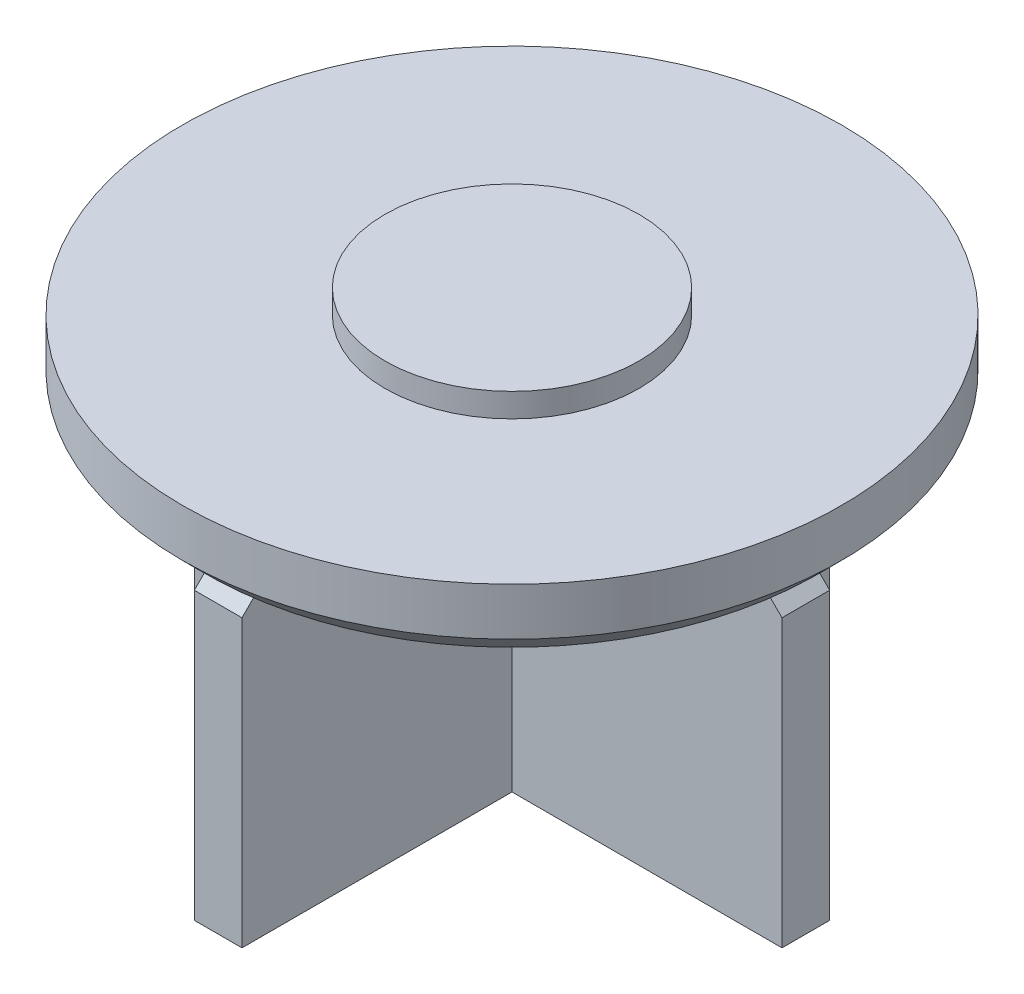
ISO-10303-21;
HEADER;
FILE_DESCRIPTION(('STEP AP214'),'2;1');
FILE_NAME('part.step','',(''),(''),'','','');
FILE_SCHEMA(('AUTOMOTIVE_DESIGN { 1 0 10303 214 1 1 1 1 }'));
ENDSEC;
DATA;
#1=APPLICATION_CONTEXT('core data for automotive mechanical design processes');
#2=APPLICATION_PROTOCOL_DEFINITION('international standard','automotive_design',2000,#1);
#3=PRODUCT_CONTEXT('',#1,'mechanical');
#4=PRODUCT('Part','Part','',(#3));
#5=PRODUCT_RELATED_PRODUCT_CATEGORY('part','',(#4));
#6=PRODUCT_DEFINITION_FORMATION('','',#4);
#7=PRODUCT_DEFINITION_CONTEXT('part definition',#1,'design');
#8=PRODUCT_DEFINITION('design','',#6,#7);
#9=PRODUCT_DEFINITION_SHAPE('','',#8);
#10=(LENGTH_UNIT() NAMED_UNIT(*) SI_UNIT(.MILLI.,.METRE.));
#11=(NAMED_UNIT(*) PLANE_ANGLE_UNIT() SI_UNIT($,.RADIAN.));
#12=(NAMED_UNIT(*) SI_UNIT($,.STERADIAN.) SOLID_ANGLE_UNIT());
#13=UNCERTAINTY_MEASURE_WITH_UNIT(LENGTH_MEASURE(1.E-05),#10,'distance_accuracy_value','');
#14=(GEOMETRIC_REPRESENTATION_CONTEXT(3) GLOBAL_UNCERTAINTY_ASSIGNED_CONTEXT((#13)) GLOBAL_UNIT_ASSIGNED_CONTEXT((#10,
#11,#12)) REPRESENTATION_CONTEXT('',''));
#15=CARTESIAN_POINT('',(0.,0.,0.));
#16=DIRECTION('',(0.,0.,1.));
#17=DIRECTION('',(1.,0.,0.));
#18=AXIS2_PLACEMENT_3D('',#15,#16,#17);
#19=CARTESIAN_POINT('',(-38.5,-12.,0.));
#20=DIRECTION('',(0.,1.,0.));
#21=DIRECTION('',(0.,0.,1.));
#22=AXIS2_PLACEMENT_3D('',#19,#20,#21);
#23=PLANE('',#22);
#24=CARTESIAN_POINT('',(0.,-12.,0.));
#25=DIRECTION('',(0.,-1.,0.));
#26=DIRECTION('',(0.,0.,-1.));
#27=AXIS2_PLACEMENT_3D('',#24,#25,#26);
#28=CIRCLE('',#27,38.5);
#29=CARTESIAN_POINT('',(0.,-12.,-38.5));
#30=VERTEX_POINT('',#29);
#31=EDGE_CURVE('E257',#30,#30,#28,.T.);
#32=ORIENTED_EDGE('',*,*,#31,.T.);
#33=EDGE_LOOP('',(#32));
#34=FACE_BOUND('',#33,.T.);
#35=DIRECTION('',(0.,0.,-1.));
#36=VECTOR('',#35,1.);
#37=CARTESIAN_POINT('',(2.99999999999988,-12.,33.));
#38=LINE('',#37,#36);
#39=CARTESIAN_POINT('',(2.99999999999988,-12.,33.));
#40=VERTEX_POINT('',#39);
#41=CARTESIAN_POINT('',(2.99999999999999,-12.,3.));
#42=VERTEX_POINT('',#41);
#43=EDGE_CURVE('E208',#40,#42,#38,.T.);
#44=ORIENTED_EDGE('',*,*,#43,.T.);
#45=DIRECTION('',(-1.,0.,0.));
#46=VECTOR('',#45,1.);
#47=CARTESIAN_POINT('',(33.,-12.,3.));
#48=LINE('',#47,#46);
#49=CARTESIAN_POINT('',(33.,-12.,3.));
#50=VERTEX_POINT('',#49);
#51=EDGE_CURVE('E238',#50,#42,#48,.T.);
#52=ORIENTED_EDGE('',*,*,#51,.F.);
#53=DIRECTION('',(0.,0.,-1.));
#54=VECTOR('',#53,1.);
#55=CARTESIAN_POINT('',(33.,-12.,3.));
#56=LINE('',#55,#54);
#57=CARTESIAN_POINT('',(33.,-12.,-3.));
#58=VERTEX_POINT('',#57);
#59=EDGE_CURVE('E241',#50,#58,#56,.T.);
#60=ORIENTED_EDGE('',*,*,#59,.T.);
#61=DIRECTION('',(-1.,0.,0.));
#62=VECTOR('',#61,1.);
#63=CARTESIAN_POINT('',(33.,-12.,-3.));
#64=LINE('',#63,#62);
#65=CARTESIAN_POINT('',(3.00000000000001,-12.,-3.));
#66=VERTEX_POINT('',#65);
#67=EDGE_CURVE('E233',#58,#66,#64,.T.);
#68=ORIENTED_EDGE('',*,*,#67,.T.);
#69=CARTESIAN_POINT('',(3.00000000000038,-12.,-32.9999999999999));
#70=VERTEX_POINT('',#69);
#71=EDGE_CURVE('E216',#66,#70,#38,.T.);
#72=ORIENTED_EDGE('',*,*,#71,.T.);
#73=DIRECTION('',(-1.,0.,0.));
#74=VECTOR('',#73,1.);
#75=CARTESIAN_POINT('',(3.00000000000035,-12.,-32.9999999999999));
#76=LINE('',#75,#74);
#77=CARTESIAN_POINT('',(-2.99999999999966,-12.,-33.));
#78=VERTEX_POINT('',#77);
#79=EDGE_CURVE('E174',#70,#78,#76,.T.);
#80=ORIENTED_EDGE('',*,*,#79,.T.);
#81=DIRECTION('',(0.,0.,1.));
#82=VECTOR('',#81,1.);
#83=CARTESIAN_POINT('',(-2.99999999999965,-12.,-33.));
#84=LINE('',#83,#82);
#85=CARTESIAN_POINT('',(-2.99999999999997,-12.,-3.));
#86=VERTEX_POINT('',#85);
#87=EDGE_CURVE('E164',#78,#86,#84,.T.);
#88=ORIENTED_EDGE('',*,*,#87,.T.);
#89=DIRECTION('',(1.,0.,0.));
#90=VECTOR('',#89,1.);
#91=CARTESIAN_POINT('',(-33.,-12.,-3.));
#92=LINE('',#91,#90);
#93=CARTESIAN_POINT('',(-33.,-12.,-3.));
#94=VERTEX_POINT('',#93);
#95=EDGE_CURVE('E186',#94,#86,#92,.T.);
#96=ORIENTED_EDGE('',*,*,#95,.F.);
#97=DIRECTION('',(0.,0.,1.));
#98=VECTOR('',#97,1.);
#99=CARTESIAN_POINT('',(-33.,-12.,-3.));
#100=LINE('',#99,#98);
#101=CARTESIAN_POINT('',(-33.,-12.,3.));
#102=VERTEX_POINT('',#101);
#103=EDGE_CURVE('E188',#94,#102,#100,.T.);
#104=ORIENTED_EDGE('',*,*,#103,.T.);
#105=DIRECTION('',(1.,0.,0.));
#106=VECTOR('',#105,1.);
#107=CARTESIAN_POINT('',(-33.,-12.,3.));
#108=LINE('',#107,#106);
#109=CARTESIAN_POINT('',(-3.00000000000001,-12.,3.));
#110=VERTEX_POINT('',#109);
#111=EDGE_CURVE('E181',#102,#110,#108,.T.);
#112=ORIENTED_EDGE('',*,*,#111,.T.);
#113=DIRECTION('',(0.,0.,-1.));
#114=VECTOR('',#113,1.);
#115=CARTESIAN_POINT('',(-3.00000000000012,-12.,33.));
#116=LINE('',#115,#114);
#117=CARTESIAN_POINT('',(-3.00000000000012,-12.,33.));
#118=VERTEX_POINT('',#117);
#119=EDGE_CURVE('E53',#118,#110,#116,.T.);
#120=ORIENTED_EDGE('',*,*,#119,.F.);
#121=DIRECTION('',(1.,0.,0.));
#122=VECTOR('',#121,1.);
#123=CARTESIAN_POINT('',(-3.00000000000012,-12.,33.));
#124=LINE('',#123,#122);
#125=EDGE_CURVE('E48',#118,#40,#124,.T.);
#126=ORIENTED_EDGE('',*,*,#125,.T.);
#127=EDGE_LOOP('',(#44,#52,#60,#68,#72,#80,#88,#96,#104,#112,#120,#126));
#128=FACE_BOUND('',#127,.T.);
#129=ADVANCED_FACE('F33',(#34,#128),#23,.F.);
#130=CARTESIAN_POINT('',(0.,0.,3.));
#131=DIRECTION('',(0.,0.,1.));
#132=DIRECTION('',(1.,0.,0.));
#133=AXIS2_PLACEMENT_3D('',#130,#131,#132);
#134=PLANE('',#133);
#135=ORIENTED_EDGE('',*,*,#51,.T.);
#136=DIRECTION('',(0.,-1.,0.));
#137=VECTOR('',#136,1.);
#138=CARTESIAN_POINT('',(2.99999999999999,0.,3.));
#139=LINE('',#138,#137);
#140=CARTESIAN_POINT('',(2.99999999999999,-52.,3.));
#141=VERTEX_POINT('',#140);
#142=EDGE_CURVE('E227',#42,#141,#139,.T.);
#143=ORIENTED_EDGE('',*,*,#142,.T.);
#144=DIRECTION('',(1.,0.,0.));
#145=VECTOR('',#144,1.);
#146=CARTESIAN_POINT('',(0.,-52.,3.));
#147=LINE('',#146,#145);
#148=CARTESIAN_POINT('',(37.,-52.,3.));
#149=VERTEX_POINT('',#148);
#150=EDGE_CURVE('E230',#141,#149,#147,.T.);
#151=ORIENTED_EDGE('',*,*,#150,.T.);
#152=DIRECTION('',(0.,1.,0.));
#153=VECTOR('',#152,1.);
#154=CARTESIAN_POINT('',(37.,-52.,3.));
#155=LINE('',#154,#153);
#156=CARTESIAN_POINT('',(37.,-16.,3.));
#157=VERTEX_POINT('',#156);
#158=EDGE_CURVE('E232',#149,#157,#155,.T.);
#159=ORIENTED_EDGE('',*,*,#158,.T.);
#160=DIRECTION('',(-0.707106781186551,0.707106781186544,0.));
#161=VECTOR('',#160,1.);
#162=CARTESIAN_POINT('',(37.,-16.,3.));
#163=LINE('',#162,#161);
#164=EDGE_CURVE('E235',#157,#50,#163,.T.);
#165=ORIENTED_EDGE('',*,*,#164,.T.);
#166=EDGE_LOOP('',(#135,#143,#151,#159,#165));
#167=FACE_BOUND('',#166,.T.);
#168=ADVANCED_FACE('F281',(#167),#134,.T.);
#169=CARTESIAN_POINT('',(0.,0.,-3.));
#170=DIRECTION('',(0.,0.,1.));
#171=DIRECTION('',(1.,0.,0.));
#172=AXIS2_PLACEMENT_3D('',#169,#170,#171);
#173=PLANE('',#172);
#174=DIRECTION('',(0.,-1.,0.));
#175=VECTOR('',#174,1.);
#176=CARTESIAN_POINT('',(3.00000000000001,0.,-3.));
#177=LINE('',#176,#175);
#178=CARTESIAN_POINT('',(3.00000000000001,-52.,-3.));
#179=VERTEX_POINT('',#178);
#180=EDGE_CURVE('E11',#66,#179,#177,.T.);
#181=ORIENTED_EDGE('',*,*,#180,.F.);
#182=ORIENTED_EDGE('',*,*,#67,.F.);
#183=DIRECTION('',(-0.707106781186551,0.707106781186544,0.));
#184=VECTOR('',#183,1.);
#185=CARTESIAN_POINT('',(37.,-16.,-3.));
#186=LINE('',#185,#184);
#187=CARTESIAN_POINT('',(37.,-16.,-3.));
#188=VERTEX_POINT('',#187);
#189=EDGE_CURVE('E245',#188,#58,#186,.T.);
#190=ORIENTED_EDGE('',*,*,#189,.F.);
#191=DIRECTION('',(0.,1.,0.));
#192=VECTOR('',#191,1.);
#193=CARTESIAN_POINT('',(37.,-52.,-3.));
#194=LINE('',#193,#192);
#195=CARTESIAN_POINT('',(37.,-52.,-3.));
#196=VERTEX_POINT('',#195);
#197=EDGE_CURVE('E243',#196,#188,#194,.T.);
#198=ORIENTED_EDGE('',*,*,#197,.F.);
#199=DIRECTION('',(1.,0.,0.));
#200=VECTOR('',#199,1.);
#201=CARTESIAN_POINT('',(0.,-52.,-3.));
#202=LINE('',#201,#200);
#203=EDGE_CURVE('E229',#179,#196,#202,.T.);
#204=ORIENTED_EDGE('',*,*,#203,.F.);
#205=EDGE_LOOP('',(#181,#182,#190,#198,#204));
#206=FACE_BOUND('',#205,.T.);
#207=ADVANCED_FACE('F274',(#206),#173,.F.);
#208=CARTESIAN_POINT('',(0.,0.,0.));
#209=DIRECTION('',(0.,-1.,0.));
#210=DIRECTION('',(0.,0.,-1.));
#211=AXIS2_PLACEMENT_3D('',#208,#209,#210);
#212=PLANE('',#211);
#213=CARTESIAN_POINT('',(0.,0.,0.));
#214=DIRECTION('',(0.,-1.,0.));
#215=DIRECTION('',(0.,0.,-1.));
#216=AXIS2_PLACEMENT_3D('',#213,#214,#215);
#217=CIRCLE('',#216,16.);
#218=CARTESIAN_POINT('',(0.,0.,-16.));
#219=VERTEX_POINT('',#218);
#220=EDGE_CURVE('E41',#219,#219,#217,.T.);
#221=ORIENTED_EDGE('',*,*,#220,.F.);
#222=EDGE_LOOP('',(#221));
#223=FACE_BOUND('',#222,.T.);
#224=ADVANCED_FACE('F35',(#223),#212,.F.);
#225=CARTESIAN_POINT('',(0.,-12.,0.));
#226=DIRECTION('',(0.,-1.,0.));
#227=DIRECTION('',(0.,0.,-1.));
#228=AXIS2_PLACEMENT_3D('',#225,#226,#227);
#229=CYLINDRICAL_SURFACE('',#228,16.);
#230=CARTESIAN_POINT('',(0.,-3.,0.));
#231=DIRECTION('',(0.,-1.,0.));
#232=DIRECTION('',(0.,0.,-1.));
#233=AXIS2_PLACEMENT_3D('',#230,#231,#232);
#234=CIRCLE('',#233,16.);
#235=CARTESIAN_POINT('',(0.,-3.,-16.));
#236=VERTEX_POINT('',#235);
#237=EDGE_CURVE('E266',#236,#236,#234,.T.);
#238=ORIENTED_EDGE('',*,*,#237,.F.);
#239=EDGE_LOOP('',(#238));
#240=FACE_BOUND('',#239,.T.);
#241=ORIENTED_EDGE('',*,*,#220,.T.);
#242=EDGE_LOOP('',(#241));
#243=FACE_BOUND('',#242,.T.);
#244=ADVANCED_FACE('F271',(#240,#243),#229,.T.);
#245=CARTESIAN_POINT('',(-16.,-3.,0.));
#246=DIRECTION('',(0.,-1.,0.));
#247=DIRECTION('',(0.,0.,-1.));
#248=AXIS2_PLACEMENT_3D('',#245,#246,#247);
#249=PLANE('',#248);
#250=CARTESIAN_POINT('',(0.,-3.,0.));
#251=DIRECTION('',(0.,-1.,0.));
#252=DIRECTION('',(0.,0.,-1.));
#253=AXIS2_PLACEMENT_3D('',#250,#251,#252);
#254=CIRCLE('',#253,41.5);
#255=CARTESIAN_POINT('',(0.,-3.,-41.5));
#256=VERTEX_POINT('',#255);
#257=EDGE_CURVE('E263',#256,#256,#254,.T.);
#258=ORIENTED_EDGE('',*,*,#257,.F.);
#259=EDGE_LOOP('',(#258));
#260=FACE_BOUND('',#259,.T.);
#261=ORIENTED_EDGE('',*,*,#237,.T.);
#262=EDGE_LOOP('',(#261));
#263=FACE_BOUND('',#262,.T.);
#264=ADVANCED_FACE('F279',(#260,#263),#249,.F.);
#265=CARTESIAN_POINT('',(0.,-12.,0.));
#266=DIRECTION('',(0.,-1.,0.));
#267=DIRECTION('',(0.,0.,-1.));
#268=AXIS2_PLACEMENT_3D('',#265,#266,#267);
#269=CYLINDRICAL_SURFACE('',#268,41.5);
#270=CARTESIAN_POINT('',(0.,-9.00000000000001,0.));
#271=DIRECTION('',(0.,-1.,0.));
#272=DIRECTION('',(0.,0.,-1.));
#273=AXIS2_PLACEMENT_3D('',#270,#271,#272);
#274=CIRCLE('',#273,41.5);
#275=CARTESIAN_POINT('',(0.,-9.00000000000001,-41.5));
#276=VERTEX_POINT('',#275);
#277=EDGE_CURVE('E260',#276,#276,#274,.T.);
#278=ORIENTED_EDGE('',*,*,#277,.F.);
#279=EDGE_LOOP('',(#278));
#280=FACE_BOUND('',#279,.T.);
#281=ORIENTED_EDGE('',*,*,#257,.T.);
#282=EDGE_LOOP('',(#281));
#283=FACE_BOUND('',#282,.T.);
#284=ADVANCED_FACE('F298',(#280,#283),#269,.T.);
#285=CARTESIAN_POINT('',(0.,-9.00000000000001,0.));
#286=DIRECTION('',(0.,1.,0.));
#287=DIRECTION('',(0.,0.,1.));
#288=AXIS2_PLACEMENT_3D('',#285,#286,#287);
#289=CONICAL_SURFACE('',#288,41.5,0.78539816339745);
#290=ORIENTED_EDGE('',*,*,#31,.F.);
#291=EDGE_LOOP('',(#290));
#292=FACE_BOUND('',#291,.T.);
#293=ORIENTED_EDGE('',*,*,#277,.T.);
#294=EDGE_LOOP('',(#293));
#295=FACE_BOUND('',#294,.T.);
#296=ADVANCED_FACE('F295',(#292,#295),#289,.T.);
#297=CARTESIAN_POINT('',(0.,-52.,3.));
#298=DIRECTION('',(0.,1.,0.));
#299=DIRECTION('',(0.,0.,1.));
#300=AXIS2_PLACEMENT_3D('',#297,#298,#299);
#301=PLANE('',#300);
#302=DIRECTION('',(0.,0.,1.));
#303=VECTOR('',#302,1.);
#304=CARTESIAN_POINT('',(3.,-52.,0.));
#305=LINE('',#304,#303);
#306=CARTESIAN_POINT('',(3.00000000000039,-52.,-37.));
#307=VERTEX_POINT('',#306);
#308=EDGE_CURVE('E144',#307,#179,#305,.T.);
#309=ORIENTED_EDGE('',*,*,#308,.T.);
#310=ORIENTED_EDGE('',*,*,#203,.T.);
#311=DIRECTION('',(0.,0.,-1.));
#312=VECTOR('',#311,1.);
#313=CARTESIAN_POINT('',(37.,-52.,3.));
#314=LINE('',#313,#312);
#315=EDGE_CURVE('E254',#149,#196,#314,.T.);
#316=ORIENTED_EDGE('',*,*,#315,.F.);
#317=ORIENTED_EDGE('',*,*,#150,.F.);
#318=CARTESIAN_POINT('',(2.99999999999987,-52.,37.));
#319=VERTEX_POINT('',#318);
#320=EDGE_CURVE('E154',#141,#319,#305,.T.);
#321=ORIENTED_EDGE('',*,*,#320,.T.);
#322=DIRECTION('',(1.,0.,0.));
#323=VECTOR('',#322,1.);
#324=CARTESIAN_POINT('',(-3.00000000000013,-52.,37.));
#325=LINE('',#324,#323);
#326=CARTESIAN_POINT('',(-3.00000000000013,-52.,37.));
#327=VERTEX_POINT('',#326);
#328=EDGE_CURVE('E222',#327,#319,#325,.T.);
#329=ORIENTED_EDGE('',*,*,#328,.F.);
#330=DIRECTION('',(0.,0.,1.));
#331=VECTOR('',#330,1.);
#332=CARTESIAN_POINT('',(-3.,-52.,0.));
#333=LINE('',#332,#331);
#334=CARTESIAN_POINT('',(-3.00000000000001,-52.,3.));
#335=VERTEX_POINT('',#334);
#336=EDGE_CURVE('E205',#335,#327,#333,.T.);
#337=ORIENTED_EDGE('',*,*,#336,.F.);
#338=DIRECTION('',(-1.,0.,0.));
#339=VECTOR('',#338,1.);
#340=CARTESIAN_POINT('',(0.,-52.,3.));
#341=LINE('',#340,#339);
#342=CARTESIAN_POINT('',(-37.,-52.,3.));
#343=VERTEX_POINT('',#342);
#344=EDGE_CURVE('E170',#335,#343,#341,.T.);
#345=ORIENTED_EDGE('',*,*,#344,.T.);
#346=DIRECTION('',(0.,0.,1.));
#347=VECTOR('',#346,1.);
#348=CARTESIAN_POINT('',(-37.,-52.,-3.));
#349=LINE('',#348,#347);
#350=CARTESIAN_POINT('',(-37.,-52.,-3.));
#351=VERTEX_POINT('',#350);
#352=EDGE_CURVE('E199',#351,#343,#349,.T.);
#353=ORIENTED_EDGE('',*,*,#352,.F.);
#354=DIRECTION('',(-1.,0.,0.));
#355=VECTOR('',#354,1.);
#356=CARTESIAN_POINT('',(0.,-52.,-3.));
#357=LINE('',#356,#355);
#358=CARTESIAN_POINT('',(-2.99999999999997,-52.,-3.));
#359=VERTEX_POINT('',#358);
#360=EDGE_CURVE('E178',#359,#351,#357,.T.);
#361=ORIENTED_EDGE('',*,*,#360,.F.);
#362=DIRECTION('',(0.,0.,-1.));
#363=VECTOR('',#362,1.);
#364=CARTESIAN_POINT('',(-3.,-52.,0.));
#365=LINE('',#364,#363);
#366=CARTESIAN_POINT('',(-2.99999999999961,-52.,-37.));
#367=VERTEX_POINT('',#366);
#368=EDGE_CURVE('E168',#359,#367,#365,.T.);
#369=ORIENTED_EDGE('',*,*,#368,.T.);
#370=DIRECTION('',(-1.,0.,0.));
#371=VECTOR('',#370,1.);
#372=CARTESIAN_POINT('',(3.00000000000039,-52.,-37.));
#373=LINE('',#372,#371);
#374=EDGE_CURVE('E159',#307,#367,#373,.T.);
#375=ORIENTED_EDGE('',*,*,#374,.F.);
#376=EDGE_LOOP('',(#309,#310,#316,#317,#321,#329,#337,#345,#353,#361,#369,#375));
#377=FACE_BOUND('',#376,.T.);
#378=ADVANCED_FACE('F166',(#377),#301,.F.);
#379=CARTESIAN_POINT('',(37.,-52.,3.));
#380=DIRECTION('',(-1.,0.,0.));
#381=DIRECTION('',(0.,0.,1.));
#382=AXIS2_PLACEMENT_3D('',#379,#380,#381);
#383=PLANE('',#382);
#384=ORIENTED_EDGE('',*,*,#197,.T.);
#385=DIRECTION('',(0.,0.,-1.));
#386=VECTOR('',#385,1.);
#387=CARTESIAN_POINT('',(37.,-16.,3.));
#388=LINE('',#387,#386);
#389=EDGE_CURVE('E251',#157,#188,#388,.T.);
#390=ORIENTED_EDGE('',*,*,#389,.F.);
#391=ORIENTED_EDGE('',*,*,#158,.F.);
#392=ORIENTED_EDGE('',*,*,#315,.T.);
#393=EDGE_LOOP('',(#384,#390,#391,#392));
#394=FACE_BOUND('',#393,.T.);
#395=ADVANCED_FACE('F328',(#394),#383,.F.);
#396=CARTESIAN_POINT('',(37.,-16.,3.));
#397=DIRECTION('',(-0.707106781186544,-0.70710678118655,0.));
#398=DIRECTION('',(0.707106781186551,-0.707106781186545,0.));
#399=AXIS2_PLACEMENT_3D('',#396,#397,#398);
#400=PLANE('',#399);
#401=ORIENTED_EDGE('',*,*,#189,.T.);
#402=ORIENTED_EDGE('',*,*,#59,.F.);
#403=ORIENTED_EDGE('',*,*,#164,.F.);
#404=ORIENTED_EDGE('',*,*,#389,.T.);
#405=EDGE_LOOP('',(#401,#402,#403,#404));
#406=FACE_BOUND('',#405,.T.);
#407=ADVANCED_FACE('F335',(#406),#400,.F.);
#408=CARTESIAN_POINT('',(3.,0.,0.));
#409=DIRECTION('',(-1.,0.,0.));
#410=DIRECTION('',(0.,0.,1.));
#411=AXIS2_PLACEMENT_3D('',#408,#409,#410);
#412=PLANE('',#411);
#413=ORIENTED_EDGE('',*,*,#71,.F.);
#414=ORIENTED_EDGE('',*,*,#180,.T.);
#415=ORIENTED_EDGE('',*,*,#308,.F.);
#416=DIRECTION('',(0.,1.,0.));
#417=VECTOR('',#416,1.);
#418=CARTESIAN_POINT('',(3.00000000000039,-52.,-37.));
#419=LINE('',#418,#417);
#420=CARTESIAN_POINT('',(3.00000000000039,-16.,-37.));
#421=VERTEX_POINT('',#420);
#422=EDGE_CURVE('E149',#307,#421,#419,.T.);
#423=ORIENTED_EDGE('',*,*,#422,.T.);
#424=DIRECTION('',(0.,0.707106781186544,0.707106781186551));
#425=VECTOR('',#424,1.);
#426=CARTESIAN_POINT('',(3.00000000000039,-16.,-37.));
#427=LINE('',#426,#425);
#428=EDGE_CURVE('E163',#421,#70,#427,.T.);
#429=ORIENTED_EDGE('',*,*,#428,.T.);
#430=EDGE_LOOP('',(#413,#414,#415,#423,#429));
#431=FACE_BOUND('',#430,.T.);
#432=ADVANCED_FACE('F147',(#431),#412,.F.);
#433=CARTESIAN_POINT('',(-3.,0.,0.));
#434=DIRECTION('',(-1.,0.,0.));
#435=DIRECTION('',(0.,0.,1.));
#436=AXIS2_PLACEMENT_3D('',#433,#434,#435);
#437=PLANE('',#436);
#438=ORIENTED_EDGE('',*,*,#119,.T.);
#439=DIRECTION('',(0.,-1.,0.));
#440=VECTOR('',#439,1.);
#441=CARTESIAN_POINT('',(-3.00000000000001,0.,3.));
#442=LINE('',#441,#440);
#443=EDGE_CURVE('E225',#110,#335,#442,.T.);
#444=ORIENTED_EDGE('',*,*,#443,.T.);
#445=ORIENTED_EDGE('',*,*,#336,.T.);
#446=DIRECTION('',(0.,1.,0.));
#447=VECTOR('',#446,1.);
#448=CARTESIAN_POINT('',(-3.00000000000013,-52.,37.));
#449=LINE('',#448,#447);
#450=CARTESIAN_POINT('',(-3.00000000000013,-16.,37.));
#451=VERTEX_POINT('',#450);
#452=EDGE_CURVE('E207',#327,#451,#449,.T.);
#453=ORIENTED_EDGE('',*,*,#452,.T.);
#454=DIRECTION('',(0.,0.707106781186544,-0.707106781186551));
#455=VECTOR('',#454,1.);
#456=CARTESIAN_POINT('',(-3.00000000000013,-16.,37.));
#457=LINE('',#456,#455);
#458=EDGE_CURVE('E210',#451,#118,#457,.T.);
#459=ORIENTED_EDGE('',*,*,#458,.T.);
#460=EDGE_LOOP('',(#438,#444,#445,#453,#459));
#461=FACE_BOUND('',#460,.T.);
#462=ADVANCED_FACE('F348',(#461),#437,.T.);
#463=CARTESIAN_POINT('',(-3.00000000000013,-52.,37.));
#464=DIRECTION('',(0.,0.,-1.));
#465=DIRECTION('',(-1.,0.,0.));
#466=AXIS2_PLACEMENT_3D('',#463,#464,#465);
#467=PLANE('',#466);
#468=DIRECTION('',(0.,1.,0.));
#469=VECTOR('',#468,1.);
#470=CARTESIAN_POINT('',(2.99999999999987,-52.,37.));
#471=LINE('',#470,#469);
#472=CARTESIAN_POINT('',(2.99999999999987,-16.,37.));
#473=VERTEX_POINT('',#472);
#474=EDGE_CURVE('E153',#319,#473,#471,.T.);
#475=ORIENTED_EDGE('',*,*,#474,.T.);
#476=DIRECTION('',(1.,0.,0.));
#477=VECTOR('',#476,1.);
#478=CARTESIAN_POINT('',(-3.00000000000013,-16.,37.));
#479=LINE('',#478,#477);
#480=EDGE_CURVE('E219',#451,#473,#479,.T.);
#481=ORIENTED_EDGE('',*,*,#480,.F.);
#482=ORIENTED_EDGE('',*,*,#452,.F.);
#483=ORIENTED_EDGE('',*,*,#328,.T.);
#484=EDGE_LOOP('',(#475,#481,#482,#483));
#485=FACE_BOUND('',#484,.T.);
#486=ADVANCED_FACE('F356',(#485),#467,.F.);
#487=CARTESIAN_POINT('',(-3.00000000000013,-16.,37.));
#488=DIRECTION('',(0.,-0.70710678118655,-0.707106781186544));
#489=DIRECTION('',(0.,0.707106781186545,-0.707106781186551));
#490=AXIS2_PLACEMENT_3D('',#487,#488,#489);
#491=PLANE('',#490);
#492=DIRECTION('',(0.,0.707106781186544,-0.707106781186551));
#493=VECTOR('',#492,1.);
#494=CARTESIAN_POINT('',(2.99999999999987,-16.,37.));
#495=LINE('',#494,#493);
#496=EDGE_CURVE('E214',#473,#40,#495,.T.);
#497=ORIENTED_EDGE('',*,*,#496,.T.);
#498=ORIENTED_EDGE('',*,*,#125,.F.);
#499=ORIENTED_EDGE('',*,*,#458,.F.);
#500=ORIENTED_EDGE('',*,*,#480,.T.);
#501=EDGE_LOOP('',(#497,#498,#499,#500));
#502=FACE_BOUND('',#501,.T.);
#503=ADVANCED_FACE('F364',(#502),#491,.F.);
#504=ORIENTED_EDGE('',*,*,#142,.F.);
#505=ORIENTED_EDGE('',*,*,#43,.F.);
#506=ORIENTED_EDGE('',*,*,#496,.F.);
#507=ORIENTED_EDGE('',*,*,#474,.F.);
#508=ORIENTED_EDGE('',*,*,#320,.F.);
#509=EDGE_LOOP('',(#504,#505,#506,#507,#508));
#510=FACE_BOUND('',#509,.T.);
#511=ADVANCED_FACE('F350',(#510),#412,.F.);
#512=CARTESIAN_POINT('',(0.,0.,-3.));
#513=DIRECTION('',(0.,0.,-1.));
#514=DIRECTION('',(-1.,0.,0.));
#515=AXIS2_PLACEMENT_3D('',#512,#513,#514);
#516=PLANE('',#515);
#517=ORIENTED_EDGE('',*,*,#95,.T.);
#518=DIRECTION('',(0.,-1.,0.));
#519=VECTOR('',#518,1.);
#520=CARTESIAN_POINT('',(-2.99999999999997,0.,-3.));
#521=LINE('',#520,#519);
#522=EDGE_CURVE('E202',#86,#359,#521,.T.);
#523=ORIENTED_EDGE('',*,*,#522,.T.);
#524=ORIENTED_EDGE('',*,*,#360,.T.);
#525=DIRECTION('',(0.,1.,0.));
#526=VECTOR('',#525,1.);
#527=CARTESIAN_POINT('',(-37.,-52.,-3.));
#528=LINE('',#527,#526);
#529=CARTESIAN_POINT('',(-37.,-16.,-3.));
#530=VERTEX_POINT('',#529);
#531=EDGE_CURVE('E180',#351,#530,#528,.T.);
#532=ORIENTED_EDGE('',*,*,#531,.T.);
#533=DIRECTION('',(0.707106781186551,0.707106781186544,0.));
#534=VECTOR('',#533,1.);
#535=CARTESIAN_POINT('',(-37.,-16.,-3.));
#536=LINE('',#535,#534);
#537=EDGE_CURVE('E183',#530,#94,#536,.T.);
#538=ORIENTED_EDGE('',*,*,#537,.T.);
#539=EDGE_LOOP('',(#517,#523,#524,#532,#538));
#540=FACE_BOUND('',#539,.T.);
#541=ADVANCED_FACE('F379',(#540),#516,.T.);
#542=CARTESIAN_POINT('',(-37.,-52.,-3.));
#543=DIRECTION('',(1.,0.,0.));
#544=DIRECTION('',(0.,0.,-1.));
#545=AXIS2_PLACEMENT_3D('',#542,#543,#544);
#546=PLANE('',#545);
#547=DIRECTION('',(0.,1.,0.));
#548=VECTOR('',#547,1.);
#549=CARTESIAN_POINT('',(-37.,-52.,3.));
#550=LINE('',#549,#548);
#551=CARTESIAN_POINT('',(-37.,-16.,3.));
#552=VERTEX_POINT('',#551);
#553=EDGE_CURVE('E172',#343,#552,#550,.T.);
#554=ORIENTED_EDGE('',*,*,#553,.T.);
#555=DIRECTION('',(0.,0.,1.));
#556=VECTOR('',#555,1.);
#557=CARTESIAN_POINT('',(-37.,-16.,-3.));
#558=LINE('',#557,#556);
#559=EDGE_CURVE('E196',#530,#552,#558,.T.);
#560=ORIENTED_EDGE('',*,*,#559,.F.);
#561=ORIENTED_EDGE('',*,*,#531,.F.);
#562=ORIENTED_EDGE('',*,*,#352,.T.);
#563=EDGE_LOOP('',(#554,#560,#561,#562));
#564=FACE_BOUND('',#563,.T.);
#565=ADVANCED_FACE('F386',(#564),#546,.F.);
#566=CARTESIAN_POINT('',(-37.,-16.,-3.));
#567=DIRECTION('',(0.707106781186544,-0.70710678118655,0.));
#568=DIRECTION('',(0.707106781186551,0.707106781186545,0.));
#569=AXIS2_PLACEMENT_3D('',#566,#567,#568);
#570=PLANE('',#569);
#571=DIRECTION('',(0.707106781186551,0.707106781186544,0.));
#572=VECTOR('',#571,1.);
#573=CARTESIAN_POINT('',(-37.,-16.,3.));
#574=LINE('',#573,#572);
#575=EDGE_CURVE('E191',#552,#102,#574,.T.);
#576=ORIENTED_EDGE('',*,*,#575,.T.);
#577=ORIENTED_EDGE('',*,*,#103,.F.);
#578=ORIENTED_EDGE('',*,*,#537,.F.);
#579=ORIENTED_EDGE('',*,*,#559,.T.);
#580=EDGE_LOOP('',(#576,#577,#578,#579));
#581=FACE_BOUND('',#580,.T.);
#582=ADVANCED_FACE('F394',(#581),#570,.F.);
#583=CARTESIAN_POINT('',(0.,0.,3.));
#584=DIRECTION('',(0.,0.,-1.));
#585=DIRECTION('',(-1.,0.,0.));
#586=AXIS2_PLACEMENT_3D('',#583,#584,#585);
#587=PLANE('',#586);
#588=ORIENTED_EDGE('',*,*,#443,.F.);
#589=ORIENTED_EDGE('',*,*,#111,.F.);
#590=ORIENTED_EDGE('',*,*,#575,.F.);
#591=ORIENTED_EDGE('',*,*,#553,.F.);
#592=ORIENTED_EDGE('',*,*,#344,.F.);
#593=EDGE_LOOP('',(#588,#589,#590,#591,#592));
#594=FACE_BOUND('',#593,.T.);
#595=ADVANCED_FACE('F402',(#594),#587,.F.);
#596=CARTESIAN_POINT('',(3.00000000000039,-52.,-37.));
#597=DIRECTION('',(0.,0.,1.));
#598=DIRECTION('',(1.,0.,0.));
#599=AXIS2_PLACEMENT_3D('',#596,#597,#598);
#600=PLANE('',#599);
#601=DIRECTION('',(0.,1.,0.));
#602=VECTOR('',#601,1.);
#603=CARTESIAN_POINT('',(-2.99999999999961,-52.,-37.));
#604=LINE('',#603,#602);
#605=CARTESIAN_POINT('',(-2.99999999999961,-16.,-37.));
#606=VERTEX_POINT('',#605);
#607=EDGE_CURVE('E518',#367,#606,#604,.T.);
#608=ORIENTED_EDGE('',*,*,#607,.T.);
#609=DIRECTION('',(-1.,0.,0.));
#610=VECTOR('',#609,1.);
#611=CARTESIAN_POINT('',(3.00000000000039,-16.,-37.));
#612=LINE('',#611,#610);
#613=EDGE_CURVE('E161',#421,#606,#612,.T.);
#614=ORIENTED_EDGE('',*,*,#613,.F.);
#615=ORIENTED_EDGE('',*,*,#422,.F.);
#616=ORIENTED_EDGE('',*,*,#374,.T.);
#617=EDGE_LOOP('',(#608,#614,#615,#616));
#618=FACE_BOUND('',#617,.T.);
#619=ADVANCED_FACE('F158',(#618),#600,.F.);
#620=CARTESIAN_POINT('',(3.00000000000039,-16.,-37.));
#621=DIRECTION('',(0.,-0.70710678118655,0.707106781186544));
#622=DIRECTION('',(0.,-0.707106781186545,-0.707106781186551));
#623=AXIS2_PLACEMENT_3D('',#620,#621,#622);
#624=PLANE('',#623);
#625=DIRECTION('',(0.,0.707106781186544,0.707106781186551));
#626=VECTOR('',#625,1.);
#627=CARTESIAN_POINT('',(-2.99999999999961,-16.,-37.));
#628=LINE('',#627,#626);
#629=EDGE_CURVE('E516',#606,#78,#628,.T.);
#630=ORIENTED_EDGE('',*,*,#629,.T.);
#631=ORIENTED_EDGE('',*,*,#79,.F.);
#632=ORIENTED_EDGE('',*,*,#428,.F.);
#633=ORIENTED_EDGE('',*,*,#613,.T.);
#634=EDGE_LOOP('',(#630,#631,#632,#633));
#635=FACE_BOUND('',#634,.T.);
#636=ADVANCED_FACE('F417',(#635),#624,.F.);
#637=CARTESIAN_POINT('',(-3.,0.,0.));
#638=DIRECTION('',(1.,0.,0.));
#639=DIRECTION('',(0.,0.,-1.));
#640=AXIS2_PLACEMENT_3D('',#637,#638,#639);
#641=PLANE('',#640);
#642=ORIENTED_EDGE('',*,*,#522,.F.);
#643=ORIENTED_EDGE('',*,*,#87,.F.);
#644=ORIENTED_EDGE('',*,*,#629,.F.);
#645=ORIENTED_EDGE('',*,*,#607,.F.);
#646=ORIENTED_EDGE('',*,*,#368,.F.);
#647=EDGE_LOOP('',(#642,#643,#644,#645,#646));
#648=FACE_BOUND('',#647,.T.);
#649=ADVANCED_FACE('F424',(#648),#641,.F.);
#650=CLOSED_SHELL('',(#129,#168,#207,#224,#244,#264,#284,#296,#378,#395,#407,#432,#462,#486,
#503,#511,#541,#565,#582,#595,#619,#636,#649));
#651=MANIFOLD_SOLID_BREP('B2',#650);
#652=ADVANCED_BREP_SHAPE_REPRESENTATION('',(#18,#651),#14);
#653=SHAPE_DEFINITION_REPRESENTATION(#9,#652);
ENDSEC;
END-ISO-10303-21;
